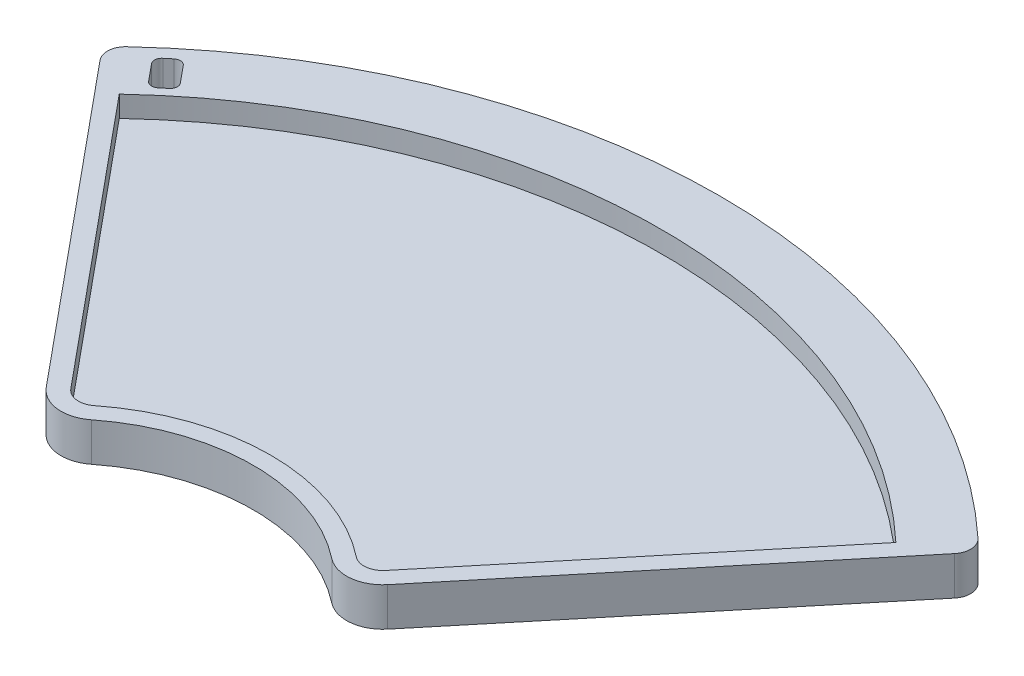
ISO-10303-21;
HEADER;
FILE_DESCRIPTION(('STEP AP214'),'2;1');
FILE_NAME('part.step','',(''),(''),'','','');
FILE_SCHEMA(('AUTOMOTIVE_DESIGN { 1 0 10303 214 1 1 1 1 }'));
ENDSEC;
DATA;
#1=APPLICATION_CONTEXT('core data for automotive mechanical design processes');
#2=APPLICATION_PROTOCOL_DEFINITION('international standard','automotive_design',2000,#1);
#3=PRODUCT_CONTEXT('',#1,'mechanical');
#4=PRODUCT('Part','Part','',(#3));
#5=PRODUCT_RELATED_PRODUCT_CATEGORY('part','',(#4));
#6=PRODUCT_DEFINITION_FORMATION('','',#4);
#7=PRODUCT_DEFINITION_CONTEXT('part definition',#1,'design');
#8=PRODUCT_DEFINITION('design','',#6,#7);
#9=PRODUCT_DEFINITION_SHAPE('','',#8);
#10=(LENGTH_UNIT() NAMED_UNIT(*) SI_UNIT(.MILLI.,.METRE.));
#11=(NAMED_UNIT(*) PLANE_ANGLE_UNIT() SI_UNIT($,.RADIAN.));
#12=(NAMED_UNIT(*) SI_UNIT($,.STERADIAN.) SOLID_ANGLE_UNIT());
#13=UNCERTAINTY_MEASURE_WITH_UNIT(LENGTH_MEASURE(1.E-05),#10,'distance_accuracy_value','');
#14=(GEOMETRIC_REPRESENTATION_CONTEXT(3) GLOBAL_UNCERTAINTY_ASSIGNED_CONTEXT((#13)) GLOBAL_UNIT_ASSIGNED_CONTEXT((#10,
#11,#12)) REPRESENTATION_CONTEXT('',''));
#15=CARTESIAN_POINT('',(0.,0.,0.));
#16=DIRECTION('',(0.,0.,1.));
#17=DIRECTION('',(1.,0.,0.));
#18=AXIS2_PLACEMENT_3D('',#15,#16,#17);
#19=CARTESIAN_POINT('',(-24.9210108639545,-6.731,51.8685663571833));
#20=DIRECTION('',(0.,1.,0.));
#21=DIRECTION('',(0.,0.,1.));
#22=AXIS2_PLACEMENT_3D('',#19,#20,#21);
#23=PLANE('',#22);
#24=CARTESIAN_POINT('',(-24.9210108639545,-6.731,51.8685663571833));
#25=DIRECTION('',(0.,1.,0.));
#26=DIRECTION('',(0.,0.,1.));
#27=AXIS2_PLACEMENT_3D('',#24,#25,#26);
#28=CIRCLE('',#27,6.35);
#29=CARTESIAN_POINT('',(-29.8154037966383,-6.731,55.9142329055404));
#30=VERTEX_POINT('',#29);
#31=CARTESIAN_POINT('',(-20.9946348860362,-6.731,56.8591646860439));
#32=VERTEX_POINT('',#31);
#33=EDGE_CURVE('E300',#30,#32,#28,.T.);
#34=ORIENTED_EDGE('',*,*,#33,.F.);
#35=DIRECTION('',(0.637112842260959,0.,0.770770540580115));
#36=VECTOR('',#35,1.);
#37=CARTESIAN_POINT('',(-74.6145407584669,-6.731,1.71684003702886));
#38=LINE('',#37,#36);
#39=CARTESIAN_POINT('',(-74.6145407584669,-6.731,1.71684003702886));
#40=VERTEX_POINT('',#39);
#41=EDGE_CURVE('E322',#40,#30,#38,.T.);
#42=ORIENTED_EDGE('',*,*,#41,.F.);
#43=CARTESIAN_POINT('',(-72.167344292125,-6.731,-0.305993237149689));
#44=DIRECTION('',(0.,1.,0.));
#45=DIRECTION('',(0.,0.,-1.));
#46=AXIS2_PLACEMENT_3D('',#43,#44,#45);
#47=CIRCLE('',#46,3.17499999999999);
#48=CARTESIAN_POINT('',(-74.3301183896062,-6.731,-2.63043579468143));
#49=VERTEX_POINT('',#48);
#50=EDGE_CURVE('E319',#49,#40,#47,.T.);
#51=ORIENTED_EDGE('',*,*,#50,.F.);
#52=CARTESIAN_POINT('',(0.,-6.731,77.2558966208939));
#53=DIRECTION('',(0.,1.,0.));
#54=DIRECTION('',(0.,0.,-1.));
#55=AXIS2_PLACEMENT_3D('',#52,#53,#54);
#56=CIRCLE('',#55,109.118250566185);
#57=CARTESIAN_POINT('',(74.3301183896061,-6.731,-2.63043579468146));
#58=VERTEX_POINT('',#57);
#59=EDGE_CURVE('E316',#58,#49,#56,.T.);
#60=ORIENTED_EDGE('',*,*,#59,.F.);
#61=CARTESIAN_POINT('',(72.167344292125,-6.731,-0.305993237149697));
#62=DIRECTION('',(0.,1.,0.));
#63=DIRECTION('',(0.,0.,1.));
#64=AXIS2_PLACEMENT_3D('',#61,#62,#63);
#65=CIRCLE('',#64,3.17500000000001);
#66=CARTESIAN_POINT('',(74.6145407584669,-6.731,1.71684003702886));
#67=VERTEX_POINT('',#66);
#68=EDGE_CURVE('E313',#67,#58,#65,.T.);
#69=ORIENTED_EDGE('',*,*,#68,.F.);
#70=DIRECTION('',(0.637112842260959,0.,-0.770770540580115));
#71=VECTOR('',#70,1.);
#72=CARTESIAN_POINT('',(74.6145407584669,-6.731,1.71684003702885));
#73=LINE('',#72,#71);
#74=CARTESIAN_POINT('',(29.8154037966383,-6.731,55.9142329055404));
#75=VERTEX_POINT('',#74);
#76=EDGE_CURVE('E310',#75,#67,#73,.T.);
#77=ORIENTED_EDGE('',*,*,#76,.F.);
#78=CARTESIAN_POINT('',(24.9210108639545,-6.731,51.8685663571833));
#79=DIRECTION('',(0.,1.,0.));
#80=DIRECTION('',(0.,0.,1.));
#81=AXIS2_PLACEMENT_3D('',#78,#79,#80);
#82=CIRCLE('',#81,6.35);
#83=CARTESIAN_POINT('',(20.9946348860362,-6.731,56.8591646860439));
#84=VERTEX_POINT('',#83);
#85=EDGE_CURVE('E307',#84,#75,#82,.T.);
#86=ORIENTED_EDGE('',*,*,#85,.F.);
#87=CARTESIAN_POINT('',(0.,-6.731,83.5442784822113));
#88=DIRECTION('',(0.,-1.,0.));
#89=DIRECTION('',(0.,0.,1.));
#90=AXIS2_PLACEMENT_3D('',#87,#88,#89);
#91=CIRCLE('',#90,33.9539392753238);
#92=EDGE_CURVE('E303',#32,#84,#91,.T.);
#93=ORIENTED_EDGE('',*,*,#92,.F.);
#94=EDGE_LOOP('',(#34,#42,#51,#60,#69,#77,#86,#93));
#95=FACE_BOUND('',#94,.T.);
#96=CARTESIAN_POINT('',(-65.1076880923366,-6.731,-1.01060798921433));
#97=DIRECTION('',(0.,1.,0.));
#98=DIRECTION('',(0.,0.,1.));
#99=AXIS2_PLACEMENT_3D('',#96,#97,#98);
#100=CIRCLE('',#99,1.27);
#101=CARTESIAN_POINT('',(-64.128566496125,-6.731,-1.8194472191185));
#102=VERTEX_POINT('',#101);
#103=CARTESIAN_POINT('',(-64.2988488624324,-6.731,-0.0314863930026936));
#104=VERTEX_POINT('',#103);
#105=EDGE_CURVE('E243',#102,#104,#100,.F.);
#106=ORIENTED_EDGE('',*,*,#105,.F.);
#107=DIRECTION('',(0.636881283389118,0.,0.770961886780813));
#108=VECTOR('',#107,1.);
#109=CARTESIAN_POINT('',(-21.8638694960724,-6.731,49.3431028404216));
#110=LINE('',#109,#108);
#111=CARTESIAN_POINT('',(-66.5591619434636,-6.731,-4.76174824280266));
#112=VERTEX_POINT('',#111);
#113=EDGE_CURVE('E218',#112,#102,#110,.T.);
#114=ORIENTED_EDGE('',*,*,#113,.F.);
#115=CARTESIAN_POINT('',(-67.5382835396753,-6.731,-3.95290901289846));
#116=DIRECTION('',(0.,1.,0.));
#117=DIRECTION('',(0.,0.,1.));
#118=AXIS2_PLACEMENT_3D('',#115,#116,#117);
#119=CIRCLE('',#118,1.27000000000001);
#120=CARTESIAN_POINT('',(-68.3471227695795,-6.731,-4.93203060911008));
#121=VERTEX_POINT('',#120);
#122=EDGE_CURVE('E187',#112,#121,#119,.T.);
#123=ORIENTED_EDGE('',*,*,#122,.T.);
#124=DIRECTION('',(-0.770961886780803,0.,0.63688128338913));
#125=VECTOR('',#124,1.);
#126=CARTESIAN_POINT('',(-70.4251425412508,-6.731,-3.21540632225181));
#127=LINE('',#126,#125);
#128=CARTESIAN_POINT('',(-69.4223123728628,-6.731,-4.04383088592398));
#129=VERTEX_POINT('',#128);
#130=EDGE_CURVE('E231',#121,#129,#127,.T.);
#131=ORIENTED_EDGE('',*,*,#130,.T.);
#132=CARTESIAN_POINT('',(-68.6134731429586,-6.731,-3.06470928971236));
#133=DIRECTION('',(0.,1.,0.));
#134=DIRECTION('',(0.,0.,1.));
#135=AXIS2_PLACEMENT_3D('',#132,#133,#134);
#136=CIRCLE('',#135,1.27000000000001);
#137=CARTESIAN_POINT('',(-69.5925947391702,-6.731,-2.25587005980817));
#138=VERTEX_POINT('',#137);
#139=EDGE_CURVE('E234',#138,#129,#136,.F.);
#140=ORIENTED_EDGE('',*,*,#139,.F.);
#141=DIRECTION('',(0.636881283389129,0.,0.770961886780804));
#142=VECTOR('',#141,1.);
#143=CARTESIAN_POINT('',(-24.8973022917783,-6.731,51.8489810234154));
#144=LINE('',#143,#142);
#145=CARTESIAN_POINT('',(-67.1619992918315,-6.731,0.686430963875939));
#146=VERTEX_POINT('',#145);
#147=EDGE_CURVE('E236',#138,#146,#144,.T.);
#148=ORIENTED_EDGE('',*,*,#147,.T.);
#149=CARTESIAN_POINT('',(-66.1828776956199,-6.731,-0.122408266028263));
#150=DIRECTION('',(0.,1.,0.));
#151=DIRECTION('',(0.,0.,1.));
#152=AXIS2_PLACEMENT_3D('',#149,#150,#151);
#153=CIRCLE('',#152,1.27000000000001);
#154=CARTESIAN_POINT('',(-65.3740384657157,-6.731,0.856713330183369));
#155=VERTEX_POINT('',#154);
#156=EDGE_CURVE('E239',#155,#146,#153,.F.);
#157=ORIENTED_EDGE('',*,*,#156,.F.);
#158=DIRECTION('',(-0.770961886780809,0.,0.636881283389122));
#159=VECTOR('',#158,1.);
#160=CARTESIAN_POINT('',(-66.3768686341032,-6.731,1.6851378938551));
#161=LINE('',#160,#159);
#162=EDGE_CURVE('E241',#104,#155,#161,.T.);
#163=ORIENTED_EDGE('',*,*,#162,.F.);
#164=EDGE_LOOP('',(#106,#114,#123,#131,#140,#148,#157,#163));
#165=FACE_BOUND('',#164,.T.);
#166=ADVANCED_FACE('F31',(#95,#165),#23,.F.);
#167=CARTESIAN_POINT('',(-24.9210108639545,0.,51.8685663571833));
#168=DIRECTION('',(0.,1.,0.));
#169=DIRECTION('',(0.,0.,1.));
#170=AXIS2_PLACEMENT_3D('',#167,#168,#169);
#171=PLANE('',#170);
#172=CARTESIAN_POINT('',(-24.9210108639545,0.,51.8685663571833));
#173=DIRECTION('',(0.,1.,0.));
#174=DIRECTION('',(0.,0.,1.));
#175=AXIS2_PLACEMENT_3D('',#172,#173,#174);
#176=CIRCLE('',#175,6.35);
#177=CARTESIAN_POINT('',(-29.8154037966383,0.,55.9142329055404));
#178=VERTEX_POINT('',#177);
#179=CARTESIAN_POINT('',(-20.9946348860362,0.,56.8591646860439));
#180=VERTEX_POINT('',#179);
#181=EDGE_CURVE('E248',#178,#180,#176,.T.);
#182=ORIENTED_EDGE('',*,*,#181,.T.);
#183=CARTESIAN_POINT('',(0.,0.,83.5442784822113));
#184=DIRECTION('',(0.,-1.,0.));
#185=DIRECTION('',(0.,0.,1.));
#186=AXIS2_PLACEMENT_3D('',#183,#184,#185);
#187=CIRCLE('',#186,33.9539392753238);
#188=CARTESIAN_POINT('',(20.9946348860362,0.,56.8591646860439));
#189=VERTEX_POINT('',#188);
#190=EDGE_CURVE('E327',#180,#189,#187,.T.);
#191=ORIENTED_EDGE('',*,*,#190,.T.);
#192=CARTESIAN_POINT('',(24.9210108639545,0.,51.8685663571833));
#193=DIRECTION('',(0.,1.,0.));
#194=DIRECTION('',(0.,0.,1.));
#195=AXIS2_PLACEMENT_3D('',#192,#193,#194);
#196=CIRCLE('',#195,6.35);
#197=CARTESIAN_POINT('',(29.8154037966383,0.,55.9142329055404));
#198=VERTEX_POINT('',#197);
#199=EDGE_CURVE('E330',#189,#198,#196,.T.);
#200=ORIENTED_EDGE('',*,*,#199,.T.);
#201=DIRECTION('',(0.637112842260959,0.,-0.770770540580115));
#202=VECTOR('',#201,1.);
#203=CARTESIAN_POINT('',(74.6145407584669,0.,1.71684003702885));
#204=LINE('',#203,#202);
#205=CARTESIAN_POINT('',(74.6145407584669,0.,1.71684003702886));
#206=VERTEX_POINT('',#205);
#207=EDGE_CURVE('E333',#198,#206,#204,.T.);
#208=ORIENTED_EDGE('',*,*,#207,.T.);
#209=CARTESIAN_POINT('',(72.167344292125,0.,-0.305993237149697));
#210=DIRECTION('',(0.,1.,0.));
#211=DIRECTION('',(0.,0.,1.));
#212=AXIS2_PLACEMENT_3D('',#209,#210,#211);
#213=CIRCLE('',#212,3.17500000000001);
#214=CARTESIAN_POINT('',(74.3301183896061,0.,-2.63043579468146));
#215=VERTEX_POINT('',#214);
#216=EDGE_CURVE('E336',#206,#215,#213,.T.);
#217=ORIENTED_EDGE('',*,*,#216,.T.);
#218=CARTESIAN_POINT('',(0.,0.,77.2558966208939));
#219=DIRECTION('',(0.,1.,0.));
#220=DIRECTION('',(0.,0.,-1.));
#221=AXIS2_PLACEMENT_3D('',#218,#219,#220);
#222=CIRCLE('',#221,109.118250566185);
#223=CARTESIAN_POINT('',(-74.3301183896062,0.,-2.63043579468143));
#224=VERTEX_POINT('',#223);
#225=EDGE_CURVE('E339',#215,#224,#222,.T.);
#226=ORIENTED_EDGE('',*,*,#225,.T.);
#227=CARTESIAN_POINT('',(-72.167344292125,0.,-0.305993237149689));
#228=DIRECTION('',(0.,1.,0.));
#229=DIRECTION('',(0.,0.,-1.));
#230=AXIS2_PLACEMENT_3D('',#227,#228,#229);
#231=CIRCLE('',#230,3.17499999999999);
#232=CARTESIAN_POINT('',(-74.6145407584669,0.,1.71684003702886));
#233=VERTEX_POINT('',#232);
#234=EDGE_CURVE('E342',#224,#233,#231,.T.);
#235=ORIENTED_EDGE('',*,*,#234,.T.);
#236=DIRECTION('',(0.637112842260959,0.,0.770770540580115));
#237=VECTOR('',#236,1.);
#238=CARTESIAN_POINT('',(-74.6145407584669,0.,1.71684003702886));
#239=LINE('',#238,#237);
#240=EDGE_CURVE('E304',#233,#178,#239,.T.);
#241=ORIENTED_EDGE('',*,*,#240,.T.);
#242=EDGE_LOOP('',(#182,#191,#200,#208,#217,#226,#235,#241));
#243=FACE_BOUND('',#242,.T.);
#244=CARTESIAN_POINT('',(-24.9210108639545,0.,51.8685663571833));
#245=DIRECTION('',(0.,1.,0.));
#246=DIRECTION('',(0.,0.,1.));
#247=AXIS2_PLACEMENT_3D('',#244,#245,#246);
#248=CIRCLE('',#247,3.302);
#249=CARTESIAN_POINT('',(-27.4660951889501,0.,53.972312962329));
#250=VERTEX_POINT('',#249);
#251=CARTESIAN_POINT('',(-22.879295355437,0.,54.4636774881908));
#252=VERTEX_POINT('',#251);
#253=EDGE_CURVE('E245',#250,#252,#248,.T.);
#254=ORIENTED_EDGE('',*,*,#253,.F.);
#255=DIRECTION('',(0.637112842260959,0.,0.770770540580115));
#256=VECTOR('',#255,1.);
#257=CARTESIAN_POINT('',(-27.4660951889501,0.,53.972312962329));
#258=LINE('',#257,#256);
#259=CARTESIAN_POINT('',(-67.8016557519721,0.,5.17489473821429));
#260=VERTEX_POINT('',#259);
#261=EDGE_CURVE('E254',#260,#250,#258,.T.);
#262=ORIENTED_EDGE('',*,*,#261,.F.);
#263=CARTESIAN_POINT('',(0.,0.,77.2558966208939));
#264=DIRECTION('',(0.,1.,0.));
#265=DIRECTION('',(0.,0.,1.));
#266=AXIS2_PLACEMENT_3D('',#263,#264,#265);
#267=CIRCLE('',#266,98.9582505661847);
#268=CARTESIAN_POINT('',(67.8016557519721,0.,5.17489473821428));
#269=VERTEX_POINT('',#268);
#270=EDGE_CURVE('E283',#269,#260,#267,.T.);
#271=ORIENTED_EDGE('',*,*,#270,.F.);
#272=DIRECTION('',(0.637112842260959,0.,-0.770770540580115));
#273=VECTOR('',#272,1.);
#274=CARTESIAN_POINT('',(7.23458189887861,0.,78.4481254102516));
#275=LINE('',#274,#273);
#276=CARTESIAN_POINT('',(27.4660951889501,0.,53.972312962329));
#277=VERTEX_POINT('',#276);
#278=EDGE_CURVE('E278',#277,#269,#275,.T.);
#279=ORIENTED_EDGE('',*,*,#278,.F.);
#280=CARTESIAN_POINT('',(24.9210108639545,0.,51.8685663571833));
#281=DIRECTION('',(0.,1.,0.));
#282=DIRECTION('',(0.,0.,1.));
#283=AXIS2_PLACEMENT_3D('',#280,#281,#282);
#284=CIRCLE('',#283,3.302);
#285=CARTESIAN_POINT('',(22.879295355437,0.,54.4636774881908));
#286=VERTEX_POINT('',#285);
#287=EDGE_CURVE('E275',#286,#277,#284,.T.);
#288=ORIENTED_EDGE('',*,*,#287,.F.);
#289=CARTESIAN_POINT('',(0.,0.,83.5442784822113));
#290=DIRECTION('',(0.,1.,0.));
#291=DIRECTION('',(0.,0.,1.));
#292=AXIS2_PLACEMENT_3D('',#289,#290,#291);
#293=CIRCLE('',#292,37.0019392753238);
#294=EDGE_CURVE('E272',#252,#286,#293,.F.);
#295=ORIENTED_EDGE('',*,*,#294,.F.);
#296=EDGE_LOOP('',(#254,#262,#271,#279,#288,#295));
#297=FACE_BOUND('',#296,.T.);
#298=DIRECTION('',(0.636881283389117,0.,0.770961886780813));
#299=VECTOR('',#298,1.);
#300=CARTESIAN_POINT('',(-93.5489881803068,0.,-37.4336572816646));
#301=LINE('',#300,#299);
#302=CARTESIAN_POINT('',(-66.5591619434636,0.,-4.76174824280265));
#303=VERTEX_POINT('',#302);
#304=CARTESIAN_POINT('',(-64.128566496125,0.,-1.81944721911849));
#305=VERTEX_POINT('',#304);
#306=EDGE_CURVE('E193',#303,#305,#301,.T.);
#307=ORIENTED_EDGE('',*,*,#306,.T.);
#308=CARTESIAN_POINT('',(-65.1076880923366,0.,-1.01060798921433));
#309=DIRECTION('',(0.,1.,0.));
#310=DIRECTION('',(0.,0.,1.));
#311=AXIS2_PLACEMENT_3D('',#308,#309,#310);
#312=CIRCLE('',#311,1.27);
#313=CARTESIAN_POINT('',(-64.2988488624324,0.,-0.0314863930026936));
#314=VERTEX_POINT('',#313);
#315=EDGE_CURVE('E56',#305,#314,#312,.F.);
#316=ORIENTED_EDGE('',*,*,#315,.T.);
#317=DIRECTION('',(-0.770961886780809,0.,0.636881283389122));
#318=VECTOR('',#317,1.);
#319=CARTESIAN_POINT('',(-87.7569502209074,0.,19.3469367887716));
#320=LINE('',#319,#318);
#321=CARTESIAN_POINT('',(-65.3740384657157,0.,0.856713330183369));
#322=VERTEX_POINT('',#321);
#323=EDGE_CURVE('E213',#314,#322,#320,.T.);
#324=ORIENTED_EDGE('',*,*,#323,.T.);
#325=CARTESIAN_POINT('',(-66.1828776956199,0.,-0.122408266028263));
#326=DIRECTION('',(0.,1.,0.));
#327=DIRECTION('',(0.,0.,1.));
#328=AXIS2_PLACEMENT_3D('',#325,#326,#327);
#329=CIRCLE('',#328,1.27000000000001);
#330=CARTESIAN_POINT('',(-67.1619992918315,0.,0.686430963875939));
#331=VERTEX_POINT('',#330);
#332=EDGE_CURVE('E210',#322,#331,#329,.F.);
#333=ORIENTED_EDGE('',*,*,#332,.T.);
#334=DIRECTION('',(0.636881283389129,0.,0.770961886780803));
#335=VECTOR('',#334,1.);
#336=CARTESIAN_POINT('',(-96.5824209760142,0.,-34.9277790986701));
#337=LINE('',#336,#335);
#338=CARTESIAN_POINT('',(-69.5925947391702,0.,-2.25587005980817));
#339=VERTEX_POINT('',#338);
#340=EDGE_CURVE('E207',#339,#331,#337,.T.);
#341=ORIENTED_EDGE('',*,*,#340,.F.);
#342=CARTESIAN_POINT('',(-68.6134731429586,0.,-3.06470928971236));
#343=DIRECTION('',(0.,1.,0.));
#344=DIRECTION('',(0.,0.,1.));
#345=AXIS2_PLACEMENT_3D('',#342,#343,#344);
#346=CIRCLE('',#345,1.27000000000001);
#347=CARTESIAN_POINT('',(-69.4223123728628,0.,-4.04383088592398));
#348=VERTEX_POINT('',#347);
#349=EDGE_CURVE('E202',#339,#348,#346,.F.);
#350=ORIENTED_EDGE('',*,*,#349,.T.);
#351=DIRECTION('',(-0.770961886780803,0.,0.63688128338913));
#352=VECTOR('',#351,1.);
#353=CARTESIAN_POINT('',(-91.805224128054,0.,14.4463925726642));
#354=LINE('',#353,#352);
#355=CARTESIAN_POINT('',(-68.3471227695795,0.,-4.93203060911008));
#356=VERTEX_POINT('',#355);
#357=EDGE_CURVE('E200',#356,#348,#354,.T.);
#358=ORIENTED_EDGE('',*,*,#357,.F.);
#359=CARTESIAN_POINT('',(-67.5382835396753,0.,-3.95290901289846));
#360=DIRECTION('',(0.,1.,0.));
#361=DIRECTION('',(0.,0.,1.));
#362=AXIS2_PLACEMENT_3D('',#359,#360,#361);
#363=CIRCLE('',#362,1.27000000000001);
#364=EDGE_CURVE('E184',#303,#356,#363,.T.);
#365=ORIENTED_EDGE('',*,*,#364,.F.);
#366=EDGE_LOOP('',(#307,#316,#324,#333,#341,#350,#358,#365));
#367=FACE_BOUND('',#366,.T.);
#368=ADVANCED_FACE('F197',(#243,#297,#367),#171,.T.);
#369=CARTESIAN_POINT('',(-24.9210108639545,-6.731,51.8685663571833));
#370=DIRECTION('',(0.,1.,0.));
#371=DIRECTION('',(0.,0.,1.));
#372=AXIS2_PLACEMENT_3D('',#369,#370,#371);
#373=CYLINDRICAL_SURFACE('',#372,6.35);
#374=ORIENTED_EDGE('',*,*,#181,.F.);
#375=DIRECTION('',(0.,1.,0.));
#376=VECTOR('',#375,1.);
#377=CARTESIAN_POINT('',(-29.8154037966383,-6.731,55.9142329055404));
#378=LINE('',#377,#376);
#379=EDGE_CURVE('E11',#30,#178,#378,.T.);
#380=ORIENTED_EDGE('',*,*,#379,.F.);
#381=ORIENTED_EDGE('',*,*,#33,.T.);
#382=DIRECTION('',(0.,1.,0.));
#383=VECTOR('',#382,1.);
#384=CARTESIAN_POINT('',(-20.9946348860362,-6.731,56.8591646860439));
#385=LINE('',#384,#383);
#386=EDGE_CURVE('E35',#32,#180,#385,.T.);
#387=ORIENTED_EDGE('',*,*,#386,.T.);
#388=EDGE_LOOP('',(#374,#380,#381,#387));
#389=FACE_BOUND('',#388,.T.);
#390=ADVANCED_FACE('F33',(#389),#373,.T.);
#391=CARTESIAN_POINT('',(-74.6145407584669,-6.731,1.71684003702886));
#392=DIRECTION('',(-0.770770540580114,0.,0.637112842260959));
#393=DIRECTION('',(0.637112842260959,0.,0.770770540580115));
#394=AXIS2_PLACEMENT_3D('',#391,#392,#393);
#395=PLANE('',#394);
#396=ORIENTED_EDGE('',*,*,#240,.F.);
#397=DIRECTION('',(0.,1.,0.));
#398=VECTOR('',#397,1.);
#399=CARTESIAN_POINT('',(-74.6145407584669,-6.731,1.71684003702886));
#400=LINE('',#399,#398);
#401=EDGE_CURVE('E40',#40,#233,#400,.T.);
#402=ORIENTED_EDGE('',*,*,#401,.F.);
#403=ORIENTED_EDGE('',*,*,#41,.T.);
#404=ORIENTED_EDGE('',*,*,#379,.T.);
#405=EDGE_LOOP('',(#396,#402,#403,#404));
#406=FACE_BOUND('',#405,.T.);
#407=ADVANCED_FACE('F369',(#406),#395,.T.);
#408=CARTESIAN_POINT('',(-72.167344292125,-6.731,-0.305993237149689));
#409=DIRECTION('',(0.,1.,0.));
#410=DIRECTION('',(0.,0.,1.));
#411=AXIS2_PLACEMENT_3D('',#408,#409,#410);
#412=CYLINDRICAL_SURFACE('',#411,3.17499999999999);
#413=ORIENTED_EDGE('',*,*,#234,.F.);
#414=DIRECTION('',(0.,1.,0.));
#415=VECTOR('',#414,1.);
#416=CARTESIAN_POINT('',(-74.3301183896062,-6.731,-2.63043579468143));
#417=LINE('',#416,#415);
#418=EDGE_CURVE('E348',#49,#224,#417,.T.);
#419=ORIENTED_EDGE('',*,*,#418,.F.);
#420=ORIENTED_EDGE('',*,*,#50,.T.);
#421=ORIENTED_EDGE('',*,*,#401,.T.);
#422=EDGE_LOOP('',(#413,#419,#420,#421));
#423=FACE_BOUND('',#422,.T.);
#424=ADVANCED_FACE('F390',(#423),#412,.T.);
#425=CARTESIAN_POINT('',(0.,-6.731,77.2558966208939));
#426=DIRECTION('',(0.,1.,0.));
#427=DIRECTION('',(0.,0.,1.));
#428=AXIS2_PLACEMENT_3D('',#425,#426,#427);
#429=CYLINDRICAL_SURFACE('',#428,109.118250566185);
#430=ORIENTED_EDGE('',*,*,#225,.F.);
#431=DIRECTION('',(0.,1.,0.));
#432=VECTOR('',#431,1.);
#433=CARTESIAN_POINT('',(74.3301183896061,-6.731,-2.63043579468146));
#434=LINE('',#433,#432);
#435=EDGE_CURVE('E350',#58,#215,#434,.T.);
#436=ORIENTED_EDGE('',*,*,#435,.F.);
#437=ORIENTED_EDGE('',*,*,#59,.T.);
#438=ORIENTED_EDGE('',*,*,#418,.T.);
#439=EDGE_LOOP('',(#430,#436,#437,#438));
#440=FACE_BOUND('',#439,.T.);
#441=ADVANCED_FACE('F388',(#440),#429,.T.);
#442=CARTESIAN_POINT('',(72.167344292125,-6.731,-0.305993237149697));
#443=DIRECTION('',(0.,1.,0.));
#444=DIRECTION('',(0.,0.,1.));
#445=AXIS2_PLACEMENT_3D('',#442,#443,#444);
#446=CYLINDRICAL_SURFACE('',#445,3.17500000000001);
#447=ORIENTED_EDGE('',*,*,#216,.F.);
#448=DIRECTION('',(0.,1.,0.));
#449=VECTOR('',#448,1.);
#450=CARTESIAN_POINT('',(74.6145407584669,-6.731,1.71684003702886));
#451=LINE('',#450,#449);
#452=EDGE_CURVE('E352',#67,#206,#451,.T.);
#453=ORIENTED_EDGE('',*,*,#452,.F.);
#454=ORIENTED_EDGE('',*,*,#68,.T.);
#455=ORIENTED_EDGE('',*,*,#435,.T.);
#456=EDGE_LOOP('',(#447,#453,#454,#455));
#457=FACE_BOUND('',#456,.T.);
#458=ADVANCED_FACE('F384',(#457),#446,.T.);
#459=CARTESIAN_POINT('',(74.6145407584669,-6.731,1.71684003702885));
#460=DIRECTION('',(0.770770540580115,0.,0.637112842260959));
#461=DIRECTION('',(0.637112842260959,0.,-0.770770540580115));
#462=AXIS2_PLACEMENT_3D('',#459,#460,#461);
#463=PLANE('',#462);
#464=ORIENTED_EDGE('',*,*,#207,.F.);
#465=DIRECTION('',(0.,1.,0.));
#466=VECTOR('',#465,1.);
#467=CARTESIAN_POINT('',(29.8154037966383,-6.731,55.9142329055404));
#468=LINE('',#467,#466);
#469=EDGE_CURVE('E354',#75,#198,#468,.T.);
#470=ORIENTED_EDGE('',*,*,#469,.F.);
#471=ORIENTED_EDGE('',*,*,#76,.T.);
#472=ORIENTED_EDGE('',*,*,#452,.T.);
#473=EDGE_LOOP('',(#464,#470,#471,#472));
#474=FACE_BOUND('',#473,.T.);
#475=ADVANCED_FACE('F382',(#474),#463,.T.);
#476=CARTESIAN_POINT('',(24.9210108639545,-6.731,51.8685663571833));
#477=DIRECTION('',(0.,1.,0.));
#478=DIRECTION('',(0.,0.,1.));
#479=AXIS2_PLACEMENT_3D('',#476,#477,#478);
#480=CYLINDRICAL_SURFACE('',#479,6.35);
#481=ORIENTED_EDGE('',*,*,#199,.F.);
#482=DIRECTION('',(0.,1.,0.));
#483=VECTOR('',#482,1.);
#484=CARTESIAN_POINT('',(20.9946348860362,-6.731,56.8591646860439));
#485=LINE('',#484,#483);
#486=EDGE_CURVE('E355',#84,#189,#485,.T.);
#487=ORIENTED_EDGE('',*,*,#486,.F.);
#488=ORIENTED_EDGE('',*,*,#85,.T.);
#489=ORIENTED_EDGE('',*,*,#469,.T.);
#490=EDGE_LOOP('',(#481,#487,#488,#489));
#491=FACE_BOUND('',#490,.T.);
#492=ADVANCED_FACE('F378',(#491),#480,.T.);
#493=CARTESIAN_POINT('',(0.,-6.731,83.5442784822113));
#494=DIRECTION('',(0.,1.,0.));
#495=DIRECTION('',(0.,0.,1.));
#496=AXIS2_PLACEMENT_3D('',#493,#494,#495);
#497=CYLINDRICAL_SURFACE('',#496,33.9539392753238);
#498=ORIENTED_EDGE('',*,*,#190,.F.);
#499=ORIENTED_EDGE('',*,*,#386,.F.);
#500=ORIENTED_EDGE('',*,*,#92,.T.);
#501=ORIENTED_EDGE('',*,*,#486,.T.);
#502=EDGE_LOOP('',(#498,#499,#500,#501));
#503=FACE_BOUND('',#502,.T.);
#504=ADVANCED_FACE('F363',(#503),#497,.F.);
#505=CARTESIAN_POINT('',(-24.9210108639545,-6.731,51.8685663571833));
#506=DIRECTION('',(0.,1.,0.));
#507=DIRECTION('',(0.,0.,1.));
#508=AXIS2_PLACEMENT_3D('',#505,#506,#507);
#509=CYLINDRICAL_SURFACE('',#508,3.302);
#510=ORIENTED_EDGE('',*,*,#253,.T.);
#511=DIRECTION('',(0.,1.,0.));
#512=VECTOR('',#511,1.);
#513=CARTESIAN_POINT('',(-22.879295355437,-6.731,54.4636774881908));
#514=LINE('',#513,#512);
#515=CARTESIAN_POINT('',(-22.879295355437,-3.683,54.4636774881908));
#516=VERTEX_POINT('',#515);
#517=EDGE_CURVE('E255',#516,#252,#514,.T.);
#518=ORIENTED_EDGE('',*,*,#517,.F.);
#519=CARTESIAN_POINT('',(-24.9210108639545,-3.683,51.8685663571833));
#520=DIRECTION('',(0.,1.,0.));
#521=DIRECTION('',(0.,0.,1.));
#522=AXIS2_PLACEMENT_3D('',#519,#520,#521);
#523=CIRCLE('',#522,3.302);
#524=CARTESIAN_POINT('',(-27.4660951889501,-3.683,53.972312962329));
#525=VERTEX_POINT('',#524);
#526=EDGE_CURVE('E250',#525,#516,#523,.T.);
#527=ORIENTED_EDGE('',*,*,#526,.F.);
#528=DIRECTION('',(0.,1.,0.));
#529=VECTOR('',#528,1.);
#530=CARTESIAN_POINT('',(-27.4660951889501,-6.731,53.972312962329));
#531=LINE('',#530,#529);
#532=EDGE_CURVE('E246',#525,#250,#531,.T.);
#533=ORIENTED_EDGE('',*,*,#532,.T.);
#534=EDGE_LOOP('',(#510,#518,#527,#533));
#535=FACE_BOUND('',#534,.T.);
#536=ADVANCED_FACE('F430',(#535),#509,.F.);
#537=CARTESIAN_POINT('',(-72.2652321507787,-6.731,-0.225079906182547));
#538=DIRECTION('',(-0.770770540580114,0.,0.637112842260959));
#539=DIRECTION('',(0.637112842260959,0.,0.770770540580115));
#540=AXIS2_PLACEMENT_3D('',#537,#538,#539);
#541=PLANE('',#540);
#542=ORIENTED_EDGE('',*,*,#261,.T.);
#543=ORIENTED_EDGE('',*,*,#532,.F.);
#544=DIRECTION('',(0.637112842260959,0.,0.770770540580115));
#545=VECTOR('',#544,1.);
#546=CARTESIAN_POINT('',(-27.4660951889501,-3.683,53.972312962329));
#547=LINE('',#546,#545);
#548=CARTESIAN_POINT('',(-67.8090922819321,-3.68718106995885,5.16375372425865));
#549=VERTEX_POINT('',#548);
#550=EDGE_CURVE('E258',#549,#525,#547,.T.);
#551=ORIENTED_EDGE('',*,*,#550,.F.);
#552=DIRECTION('',(0.,1.,0.));
#553=VECTOR('',#552,1.);
#554=CARTESIAN_POINT('',(-67.8016557519721,-6.731,5.17489473821429));
#555=LINE('',#554,#553);
#556=EDGE_CURVE('E286',#549,#260,#555,.T.);
#557=ORIENTED_EDGE('',*,*,#556,.T.);
#558=EDGE_LOOP('',(#542,#543,#551,#557));
#559=FACE_BOUND('',#558,.T.);
#560=ADVANCED_FACE('F426',(#559),#541,.F.);
#561=CARTESIAN_POINT('',(0.,-6.731,77.2558966208939));
#562=DIRECTION('',(0.,1.,0.));
#563=DIRECTION('',(0.,0.,1.));
#564=AXIS2_PLACEMENT_3D('',#561,#562,#563);
#565=CYLINDRICAL_SURFACE('',#564,98.9582505661847);
#566=ORIENTED_EDGE('',*,*,#270,.T.);
#567=ORIENTED_EDGE('',*,*,#556,.F.);
#568=CARTESIAN_POINT('',(0.,-3.683,77.2558966208939));
#569=DIRECTION('',(0.,1.,0.));
#570=DIRECTION('',(0.,0.,1.));
#571=AXIS2_PLACEMENT_3D('',#568,#569,#570);
#572=CIRCLE('',#571,98.9582505661847);
#573=CARTESIAN_POINT('',(67.8016557519721,-3.683,5.17489473821428));
#574=VERTEX_POINT('',#573);
#575=EDGE_CURVE('E263',#574,#549,#572,.T.);
#576=ORIENTED_EDGE('',*,*,#575,.F.);
#577=DIRECTION('',(0.,1.,0.));
#578=VECTOR('',#577,1.);
#579=CARTESIAN_POINT('',(67.8016557519721,-6.731,5.17489473821428));
#580=LINE('',#579,#578);
#581=EDGE_CURVE('E281',#269,#574,#580,.F.);
#582=ORIENTED_EDGE('',*,*,#581,.F.);
#583=EDGE_LOOP('',(#566,#567,#576,#582));
#584=FACE_BOUND('',#583,.T.);
#585=ADVANCED_FACE('F422',(#584),#565,.F.);
#586=CARTESIAN_POINT('',(72.2652321507787,-6.731,-0.225079906182555));
#587=DIRECTION('',(0.770770540580115,0.,0.637112842260959));
#588=DIRECTION('',(0.637112842260959,0.,-0.770770540580115));
#589=AXIS2_PLACEMENT_3D('',#586,#587,#588);
#590=PLANE('',#589);
#591=ORIENTED_EDGE('',*,*,#278,.T.);
#592=ORIENTED_EDGE('',*,*,#581,.T.);
#593=DIRECTION('',(0.637112842260959,0.,-0.770770540580115));
#594=VECTOR('',#593,1.);
#595=CARTESIAN_POINT('',(7.23458189887861,-3.683,78.4481254102516));
#596=LINE('',#595,#594);
#597=CARTESIAN_POINT('',(27.4660951889501,-3.683,53.972312962329));
#598=VERTEX_POINT('',#597);
#599=EDGE_CURVE('E260',#598,#574,#596,.T.);
#600=ORIENTED_EDGE('',*,*,#599,.F.);
#601=DIRECTION('',(0.,1.,0.));
#602=VECTOR('',#601,1.);
#603=CARTESIAN_POINT('',(27.4660951889501,-6.731,53.972312962329));
#604=LINE('',#603,#602);
#605=EDGE_CURVE('E249',#598,#277,#604,.T.);
#606=ORIENTED_EDGE('',*,*,#605,.T.);
#607=EDGE_LOOP('',(#591,#592,#600,#606));
#608=FACE_BOUND('',#607,.T.);
#609=ADVANCED_FACE('F418',(#608),#590,.F.);
#610=CARTESIAN_POINT('',(24.9210108639545,-6.731,51.8685663571833));
#611=DIRECTION('',(0.,1.,0.));
#612=DIRECTION('',(0.,0.,1.));
#613=AXIS2_PLACEMENT_3D('',#610,#611,#612);
#614=CYLINDRICAL_SURFACE('',#613,3.302);
#615=ORIENTED_EDGE('',*,*,#287,.T.);
#616=ORIENTED_EDGE('',*,*,#605,.F.);
#617=CARTESIAN_POINT('',(24.9210108639545,-3.683,51.8685663571833));
#618=DIRECTION('',(0.,1.,0.));
#619=DIRECTION('',(0.,0.,1.));
#620=AXIS2_PLACEMENT_3D('',#617,#618,#619);
#621=CIRCLE('',#620,3.302);
#622=CARTESIAN_POINT('',(22.879295355437,-3.683,54.4636774881908));
#623=VERTEX_POINT('',#622);
#624=EDGE_CURVE('E264',#623,#598,#621,.T.);
#625=ORIENTED_EDGE('',*,*,#624,.F.);
#626=DIRECTION('',(0.,1.,0.));
#627=VECTOR('',#626,1.);
#628=CARTESIAN_POINT('',(22.879295355437,-6.731,54.4636774881908));
#629=LINE('',#628,#627);
#630=EDGE_CURVE('E257',#623,#286,#629,.T.);
#631=ORIENTED_EDGE('',*,*,#630,.T.);
#632=EDGE_LOOP('',(#615,#616,#625,#631));
#633=FACE_BOUND('',#632,.T.);
#634=ADVANCED_FACE('F414',(#633),#614,.F.);
#635=CARTESIAN_POINT('',(0.,-6.731,83.5442784822113));
#636=DIRECTION('',(0.,1.,0.));
#637=DIRECTION('',(0.,0.,1.));
#638=AXIS2_PLACEMENT_3D('',#635,#636,#637);
#639=CYLINDRICAL_SURFACE('',#638,37.0019392753238);
#640=ORIENTED_EDGE('',*,*,#294,.T.);
#641=ORIENTED_EDGE('',*,*,#630,.F.);
#642=CARTESIAN_POINT('',(0.,-3.683,83.5442784822113));
#643=DIRECTION('',(0.,1.,0.));
#644=DIRECTION('',(0.,0.,1.));
#645=AXIS2_PLACEMENT_3D('',#642,#643,#644);
#646=CIRCLE('',#645,37.0019392753238);
#647=EDGE_CURVE('E253',#516,#623,#646,.F.);
#648=ORIENTED_EDGE('',*,*,#647,.F.);
#649=ORIENTED_EDGE('',*,*,#517,.T.);
#650=EDGE_LOOP('',(#640,#641,#648,#649));
#651=FACE_BOUND('',#650,.T.);
#652=ADVANCED_FACE('F410',(#651),#639,.T.);
#653=CARTESIAN_POINT('',(-24.9210108639545,-3.683,51.8685663571833));
#654=DIRECTION('',(0.,1.,0.));
#655=DIRECTION('',(0.,0.,1.));
#656=AXIS2_PLACEMENT_3D('',#653,#654,#655);
#657=PLANE('',#656);
#658=ORIENTED_EDGE('',*,*,#526,.T.);
#659=ORIENTED_EDGE('',*,*,#647,.T.);
#660=ORIENTED_EDGE('',*,*,#624,.T.);
#661=ORIENTED_EDGE('',*,*,#599,.T.);
#662=ORIENTED_EDGE('',*,*,#575,.T.);
#663=ORIENTED_EDGE('',*,*,#550,.T.);
#664=EDGE_LOOP('',(#658,#659,#660,#661,#662,#663));
#665=FACE_BOUND('',#664,.T.);
#666=ADVANCED_FACE('F406',(#665),#657,.T.);
#667=CARTESIAN_POINT('',(-65.1076880923366,-16.764,-1.01060798921433));
#668=DIRECTION('',(0.,1.,0.));
#669=DIRECTION('',(0.,0.,1.));
#670=AXIS2_PLACEMENT_3D('',#667,#668,#669);
#671=CYLINDRICAL_SURFACE('',#670,1.27);
#672=ORIENTED_EDGE('',*,*,#105,.T.);
#673=DIRECTION('',(0.,1.,0.));
#674=VECTOR('',#673,1.);
#675=CARTESIAN_POINT('',(-64.2988488624324,-16.764,-0.0314863930026936));
#676=LINE('',#675,#674);
#677=EDGE_CURVE('E216',#104,#314,#676,.T.);
#678=ORIENTED_EDGE('',*,*,#677,.T.);
#679=ORIENTED_EDGE('',*,*,#315,.F.);
#680=DIRECTION('',(0.,1.,0.));
#681=VECTOR('',#680,1.);
#682=CARTESIAN_POINT('',(-64.128566496125,-16.764,-1.8194472191185));
#683=LINE('',#682,#681);
#684=EDGE_CURVE('E190',#102,#305,#683,.T.);
#685=ORIENTED_EDGE('',*,*,#684,.F.);
#686=EDGE_LOOP('',(#672,#678,#679,#685));
#687=FACE_BOUND('',#686,.T.);
#688=ADVANCED_FACE('F409',(#687),#671,.F.);
#689=CARTESIAN_POINT('',(-87.7569502209074,-16.764,19.3469367887716));
#690=DIRECTION('',(-0.636881283389122,0.,-0.770961886780809));
#691=DIRECTION('',(-0.770961886780809,0.,0.636881283389122));
#692=AXIS2_PLACEMENT_3D('',#689,#690,#691);
#693=PLANE('',#692);
#694=ORIENTED_EDGE('',*,*,#162,.T.);
#695=DIRECTION('',(0.,1.,0.));
#696=VECTOR('',#695,1.);
#697=CARTESIAN_POINT('',(-65.3740384657157,-16.764,0.856713330183369));
#698=LINE('',#697,#696);
#699=EDGE_CURVE('E219',#155,#322,#698,.T.);
#700=ORIENTED_EDGE('',*,*,#699,.T.);
#701=ORIENTED_EDGE('',*,*,#323,.F.);
#702=ORIENTED_EDGE('',*,*,#677,.F.);
#703=EDGE_LOOP('',(#694,#700,#701,#702));
#704=FACE_BOUND('',#703,.T.);
#705=ADVANCED_FACE('F437',(#704),#693,.T.);
#706=CARTESIAN_POINT('',(-66.1828776956199,-16.764,-0.122408266028263));
#707=DIRECTION('',(0.,1.,0.));
#708=DIRECTION('',(0.,0.,1.));
#709=AXIS2_PLACEMENT_3D('',#706,#707,#708);
#710=CYLINDRICAL_SURFACE('',#709,1.27000000000001);
#711=ORIENTED_EDGE('',*,*,#156,.T.);
#712=DIRECTION('',(0.,1.,0.));
#713=VECTOR('',#712,1.);
#714=CARTESIAN_POINT('',(-67.1619992918315,-16.764,0.686430963875939));
#715=LINE('',#714,#713);
#716=EDGE_CURVE('E221',#146,#331,#715,.T.);
#717=ORIENTED_EDGE('',*,*,#716,.T.);
#718=ORIENTED_EDGE('',*,*,#332,.F.);
#719=ORIENTED_EDGE('',*,*,#699,.F.);
#720=EDGE_LOOP('',(#711,#717,#718,#719));
#721=FACE_BOUND('',#720,.T.);
#722=ADVANCED_FACE('F453',(#721),#710,.F.);
#723=CARTESIAN_POINT('',(-96.5824209760142,-16.764,-34.9277790986701));
#724=DIRECTION('',(-0.770961886780803,0.,0.636881283389129));
#725=DIRECTION('',(0.636881283389129,0.,0.770961886780804));
#726=AXIS2_PLACEMENT_3D('',#723,#724,#725);
#727=PLANE('',#726);
#728=DIRECTION('',(0.,1.,0.));
#729=VECTOR('',#728,1.);
#730=CARTESIAN_POINT('',(-69.5925947391702,-16.764,-2.25587005980817));
#731=LINE('',#730,#729);
#732=EDGE_CURVE('E223',#138,#339,#731,.T.);
#733=ORIENTED_EDGE('',*,*,#732,.T.);
#734=ORIENTED_EDGE('',*,*,#340,.T.);
#735=ORIENTED_EDGE('',*,*,#716,.F.);
#736=ORIENTED_EDGE('',*,*,#147,.F.);
#737=EDGE_LOOP('',(#733,#734,#735,#736));
#738=FACE_BOUND('',#737,.T.);
#739=ADVANCED_FACE('F449',(#738),#727,.F.);
#740=CARTESIAN_POINT('',(-68.6134731429586,-16.764,-3.06470928971236));
#741=DIRECTION('',(0.,1.,0.));
#742=DIRECTION('',(0.,0.,1.));
#743=AXIS2_PLACEMENT_3D('',#740,#741,#742);
#744=CYLINDRICAL_SURFACE('',#743,1.27000000000001);
#745=ORIENTED_EDGE('',*,*,#139,.T.);
#746=DIRECTION('',(0.,1.,0.));
#747=VECTOR('',#746,1.);
#748=CARTESIAN_POINT('',(-69.4223123728628,-16.764,-4.04383088592398));
#749=LINE('',#748,#747);
#750=EDGE_CURVE('E225',#129,#348,#749,.T.);
#751=ORIENTED_EDGE('',*,*,#750,.T.);
#752=ORIENTED_EDGE('',*,*,#349,.F.);
#753=ORIENTED_EDGE('',*,*,#732,.F.);
#754=EDGE_LOOP('',(#745,#751,#752,#753));
#755=FACE_BOUND('',#754,.T.);
#756=ADVANCED_FACE('F445',(#755),#744,.F.);
#757=CARTESIAN_POINT('',(-91.805224128054,-16.764,14.4463925726642));
#758=DIRECTION('',(-0.63688128338913,0.,-0.770961886780803));
#759=DIRECTION('',(-0.770961886780803,0.,0.63688128338913));
#760=AXIS2_PLACEMENT_3D('',#757,#758,#759);
#761=PLANE('',#760);
#762=DIRECTION('',(0.,1.,0.));
#763=VECTOR('',#762,1.);
#764=CARTESIAN_POINT('',(-68.3471227695795,-16.764,-4.93203060911008));
#765=LINE('',#764,#763);
#766=EDGE_CURVE('E189',#121,#356,#765,.T.);
#767=ORIENTED_EDGE('',*,*,#766,.T.);
#768=ORIENTED_EDGE('',*,*,#357,.T.);
#769=ORIENTED_EDGE('',*,*,#750,.F.);
#770=ORIENTED_EDGE('',*,*,#130,.F.);
#771=EDGE_LOOP('',(#767,#768,#769,#770));
#772=FACE_BOUND('',#771,.T.);
#773=ADVANCED_FACE('F442',(#772),#761,.F.);
#774=CARTESIAN_POINT('',(-67.5382835396753,-16.764,-3.95290901289846));
#775=DIRECTION('',(0.,1.,0.));
#776=DIRECTION('',(0.,0.,1.));
#777=AXIS2_PLACEMENT_3D('',#774,#775,#776);
#778=CYLINDRICAL_SURFACE('',#777,1.27000000000001);
#779=DIRECTION('',(0.,1.,0.));
#780=VECTOR('',#779,1.);
#781=CARTESIAN_POINT('',(-66.5591619434636,-16.764,-4.76174824280265));
#782=LINE('',#781,#780);
#783=EDGE_CURVE('E48',#112,#303,#782,.T.);
#784=ORIENTED_EDGE('',*,*,#783,.T.);
#785=ORIENTED_EDGE('',*,*,#364,.T.);
#786=ORIENTED_EDGE('',*,*,#766,.F.);
#787=ORIENTED_EDGE('',*,*,#122,.F.);
#788=EDGE_LOOP('',(#784,#785,#786,#787));
#789=FACE_BOUND('',#788,.T.);
#790=ADVANCED_FACE('F181',(#789),#778,.F.);
#791=CARTESIAN_POINT('',(-93.5489881803068,-16.764,-37.4336572816646));
#792=DIRECTION('',(-0.770961886780813,0.,0.636881283389118));
#793=DIRECTION('',(0.636881283389118,0.,0.770961886780813));
#794=AXIS2_PLACEMENT_3D('',#791,#792,#793);
#795=PLANE('',#794);
#796=ORIENTED_EDGE('',*,*,#113,.T.);
#797=ORIENTED_EDGE('',*,*,#684,.T.);
#798=ORIENTED_EDGE('',*,*,#306,.F.);
#799=ORIENTED_EDGE('',*,*,#783,.F.);
#800=EDGE_LOOP('',(#796,#797,#798,#799));
#801=FACE_BOUND('',#800,.T.);
#802=ADVANCED_FACE('F194',(#801),#795,.T.);
#803=CLOSED_SHELL('',(#166,#368,#390,#407,#424,#441,#458,#475,#492,#504,#536,#560,#585,#609,
#634,#652,#666,#688,#705,#722,#739,#756,#773,#790,#802));
#804=MANIFOLD_SOLID_BREP('B2',#803);
#805=ADVANCED_BREP_SHAPE_REPRESENTATION('',(#18,#804),#14);
#806=SHAPE_DEFINITION_REPRESENTATION(#9,#805);
ENDSEC;
END-ISO-10303-21;
